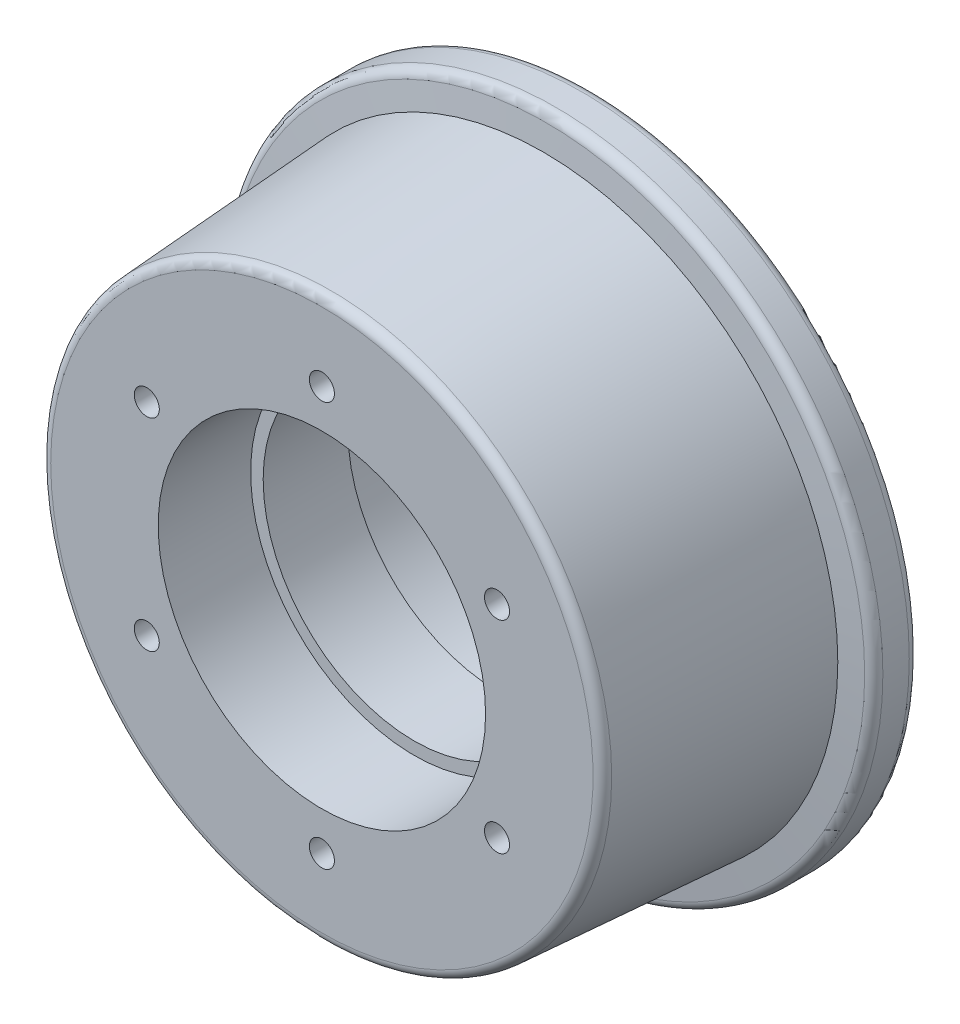
ISO-10303-21;
HEADER;
FILE_DESCRIPTION(('STEP AP214'),'2;1');
FILE_NAME('part.step','',(''),(''),'','','');
FILE_SCHEMA(('AUTOMOTIVE_DESIGN { 1 0 10303 214 1 1 1 1 }'));
ENDSEC;
DATA;
#1=APPLICATION_CONTEXT('core data for automotive mechanical design processes');
#2=APPLICATION_PROTOCOL_DEFINITION('international standard','automotive_design',2000,#1);
#3=PRODUCT_CONTEXT('',#1,'mechanical');
#4=PRODUCT('Part','Part','',(#3));
#5=PRODUCT_RELATED_PRODUCT_CATEGORY('part','',(#4));
#6=PRODUCT_DEFINITION_FORMATION('','',#4);
#7=PRODUCT_DEFINITION_CONTEXT('part definition',#1,'design');
#8=PRODUCT_DEFINITION('design','',#6,#7);
#9=PRODUCT_DEFINITION_SHAPE('','',#8);
#10=(LENGTH_UNIT() NAMED_UNIT(*) SI_UNIT(.MILLI.,.METRE.));
#11=(NAMED_UNIT(*) PLANE_ANGLE_UNIT() SI_UNIT($,.RADIAN.));
#12=(NAMED_UNIT(*) SI_UNIT($,.STERADIAN.) SOLID_ANGLE_UNIT());
#13=UNCERTAINTY_MEASURE_WITH_UNIT(LENGTH_MEASURE(1.E-05),#10,'distance_accuracy_value','');
#14=(GEOMETRIC_REPRESENTATION_CONTEXT(3) GLOBAL_UNCERTAINTY_ASSIGNED_CONTEXT((#13)) GLOBAL_UNIT_ASSIGNED_CONTEXT((#10,
#11,#12)) REPRESENTATION_CONTEXT('',''));
#15=CARTESIAN_POINT('',(0.,0.,0.));
#16=DIRECTION('',(0.,0.,1.));
#17=DIRECTION('',(1.,0.,0.));
#18=AXIS2_PLACEMENT_3D('',#15,#16,#17);
#19=CARTESIAN_POINT('',(0.,78.5,22.));
#20=DIRECTION('',(0.,0.,-1.));
#21=DIRECTION('',(-1.,0.,0.));
#22=AXIS2_PLACEMENT_3D('',#19,#20,#21);
#23=PLANE('',#22);
#24=CARTESIAN_POINT('',(0.,0.,22.));
#25=DIRECTION('',(0.,0.,1.));
#26=DIRECTION('',(1.,0.,0.));
#27=AXIS2_PLACEMENT_3D('',#24,#25,#26);
#28=CIRCLE('',#27,78.5);
#29=CARTESIAN_POINT('',(78.5,0.,22.));
#30=VERTEX_POINT('',#29);
#31=EDGE_CURVE('E58',#30,#30,#28,.T.);
#32=ORIENTED_EDGE('',*,*,#31,.F.);
#33=EDGE_LOOP('',(#32));
#34=FACE_BOUND('',#33,.T.);
#35=CARTESIAN_POINT('',(0.,0.,22.));
#36=DIRECTION('',(0.,0.,1.));
#37=DIRECTION('',(1.,0.,0.));
#38=AXIS2_PLACEMENT_3D('',#35,#36,#37);
#39=CIRCLE('',#38,85.);
#40=CARTESIAN_POINT('',(85.,0.,22.));
#41=VERTEX_POINT('',#40);
#42=EDGE_CURVE('E82',#41,#41,#39,.T.);
#43=ORIENTED_EDGE('',*,*,#42,.T.);
#44=EDGE_LOOP('',(#43));
#45=FACE_BOUND('',#44,.T.);
#46=ADVANCED_FACE('F32',(#34,#45),#23,.F.);
#47=CARTESIAN_POINT('',(0.,0.,1000.));
#48=DIRECTION('',(0.,0.,1.));
#49=DIRECTION('',(1.,0.,0.));
#50=AXIS2_PLACEMENT_3D('',#47,#48,#49);
#51=CYLINDRICAL_SURFACE('',#50,78.5);
#52=CARTESIAN_POINT('',(0.,0.,-22.));
#53=DIRECTION('',(0.,0.,1.));
#54=DIRECTION('',(1.,0.,0.));
#55=AXIS2_PLACEMENT_3D('',#52,#53,#54);
#56=CIRCLE('',#55,78.5);
#57=CARTESIAN_POINT('',(78.5,0.,-22.));
#58=VERTEX_POINT('',#57);
#59=EDGE_CURVE('E61',#58,#58,#56,.T.);
#60=ORIENTED_EDGE('',*,*,#59,.F.);
#61=EDGE_LOOP('',(#60));
#62=FACE_BOUND('',#61,.T.);
#63=ORIENTED_EDGE('',*,*,#31,.T.);
#64=EDGE_LOOP('',(#63));
#65=FACE_BOUND('',#64,.T.);
#66=ADVANCED_FACE('F195',(#62,#65),#51,.F.);
#67=CARTESIAN_POINT('',(0.,78.5,-22.));
#68=DIRECTION('',(0.,0.,1.));
#69=DIRECTION('',(1.,0.,0.));
#70=AXIS2_PLACEMENT_3D('',#67,#68,#69);
#71=PLANE('',#70);
#72=CARTESIAN_POINT('',(0.,0.,-22.));
#73=DIRECTION('',(0.,0.,1.));
#74=DIRECTION('',(1.,0.,0.));
#75=AXIS2_PLACEMENT_3D('',#72,#73,#74);
#76=CIRCLE('',#75,85.);
#77=CARTESIAN_POINT('',(85.,0.,-22.));
#78=VERTEX_POINT('',#77);
#79=EDGE_CURVE('E64',#78,#78,#76,.T.);
#80=ORIENTED_EDGE('',*,*,#79,.F.);
#81=EDGE_LOOP('',(#80));
#82=FACE_BOUND('',#81,.T.);
#83=ORIENTED_EDGE('',*,*,#59,.T.);
#84=EDGE_LOOP('',(#83));
#85=FACE_BOUND('',#84,.T.);
#86=ADVANCED_FACE('F189',(#82,#85),#71,.F.);
#87=CARTESIAN_POINT('',(0.,0.,1000.));
#88=DIRECTION('',(0.,0.,1.));
#89=DIRECTION('',(1.,0.,0.));
#90=AXIS2_PLACEMENT_3D('',#87,#88,#89);
#91=CYLINDRICAL_SURFACE('',#90,85.);
#92=CARTESIAN_POINT('',(0.,0.,-75.));
#93=DIRECTION('',(0.,0.,1.));
#94=DIRECTION('',(1.,0.,0.));
#95=AXIS2_PLACEMENT_3D('',#92,#93,#94);
#96=CIRCLE('',#95,85.);
#97=CARTESIAN_POINT('',(85.,0.,-75.));
#98=VERTEX_POINT('',#97);
#99=EDGE_CURVE('E67',#98,#98,#96,.T.);
#100=ORIENTED_EDGE('',*,*,#99,.F.);
#101=EDGE_LOOP('',(#100));
#102=FACE_BOUND('',#101,.T.);
#103=ORIENTED_EDGE('',*,*,#79,.T.);
#104=EDGE_LOOP('',(#103));
#105=FACE_BOUND('',#104,.T.);
#106=ADVANCED_FACE('F171',(#102,#105),#91,.F.);
#107=CARTESIAN_POINT('',(0.,85.,-75.));
#108=DIRECTION('',(0.,0.,1.));
#109=DIRECTION('',(1.,0.,0.));
#110=AXIS2_PLACEMENT_3D('',#107,#108,#109);
#111=PLANE('',#110);
#112=CARTESIAN_POINT('',(99.5929214352098,57.5000000000012,-75.));
#113=DIRECTION('',(0.,0.,-1.));
#114=DIRECTION('',(-0.50000000000001,0.866025403784433,0.));
#115=AXIS2_PLACEMENT_3D('',#112,#113,#114);
#116=CIRCLE('',#115,8.);
#117=CARTESIAN_POINT('',(95.5929214352097,64.4282032302766,-75.));
#118=VERTEX_POINT('',#117);
#119=EDGE_CURVE('E152',#118,#118,#116,.T.);
#120=ORIENTED_EDGE('',*,*,#119,.F.);
#121=EDGE_LOOP('',(#120));
#122=FACE_BOUND('',#121,.T.);
#123=CARTESIAN_POINT('',(99.592921435211,-57.4999999999991,-75.));
#124=DIRECTION('',(0.,0.,-1.));
#125=DIRECTION('',(0.499999999999992,0.866025403784443,0.));
#126=AXIS2_PLACEMENT_3D('',#123,#124,#125);
#127=CIRCLE('',#126,8.);
#128=CARTESIAN_POINT('',(103.592921435211,-50.5717967697235,-75.));
#129=VERTEX_POINT('',#128);
#130=EDGE_CURVE('E146',#129,#129,#127,.T.);
#131=ORIENTED_EDGE('',*,*,#130,.F.);
#132=EDGE_LOOP('',(#131));
#133=FACE_BOUND('',#132,.T.);
#134=CARTESIAN_POINT('',(0.,-115.,-75.));
#135=DIRECTION('',(0.,0.,-1.));
#136=DIRECTION('',(1.,0.,0.));
#137=AXIS2_PLACEMENT_3D('',#134,#135,#136);
#138=CIRCLE('',#137,8.);
#139=CARTESIAN_POINT('',(8.,-115.,-75.));
#140=VERTEX_POINT('',#139);
#141=EDGE_CURVE('E140',#140,#140,#138,.T.);
#142=ORIENTED_EDGE('',*,*,#141,.F.);
#143=EDGE_LOOP('',(#142));
#144=FACE_BOUND('',#143,.T.);
#145=CARTESIAN_POINT('',(-99.5929214352102,-57.5000000000005,-75.));
#146=DIRECTION('',(0.,0.,-1.));
#147=DIRECTION('',(0.500000000000004,-0.866025403784436,0.));
#148=AXIS2_PLACEMENT_3D('',#145,#146,#147);
#149=CIRCLE('',#148,8.);
#150=CARTESIAN_POINT('',(-95.5929214352102,-64.428203230276,-75.));
#151=VERTEX_POINT('',#150);
#152=EDGE_CURVE('E134',#151,#151,#149,.T.);
#153=ORIENTED_EDGE('',*,*,#152,.F.);
#154=EDGE_LOOP('',(#153));
#155=FACE_BOUND('',#154,.T.);
#156=CARTESIAN_POINT('',(-99.5929214352106,57.4999999999998,-75.));
#157=DIRECTION('',(0.,0.,-1.));
#158=DIRECTION('',(-0.499999999999998,-0.86602540378444,0.));
#159=AXIS2_PLACEMENT_3D('',#156,#157,#158);
#160=CIRCLE('',#159,8.);
#161=CARTESIAN_POINT('',(-103.592921435211,50.5717967697243,-75.));
#162=VERTEX_POINT('',#161);
#163=EDGE_CURVE('E128',#162,#162,#160,.T.);
#164=ORIENTED_EDGE('',*,*,#163,.F.);
#165=EDGE_LOOP('',(#164));
#166=FACE_BOUND('',#165,.T.);
#167=CARTESIAN_POINT('',(0.,115.,-75.));
#168=DIRECTION('',(0.,0.,-1.));
#169=DIRECTION('',(-1.,0.,0.));
#170=AXIS2_PLACEMENT_3D('',#167,#168,#169);
#171=CIRCLE('',#170,8.);
#172=CARTESIAN_POINT('',(-8.,115.,-75.));
#173=VERTEX_POINT('',#172);
#174=EDGE_CURVE('E122',#173,#173,#171,.T.);
#175=ORIENTED_EDGE('',*,*,#174,.F.);
#176=EDGE_LOOP('',(#175));
#177=FACE_BOUND('',#176,.T.);
#178=CARTESIAN_POINT('',(0.,0.,-75.));
#179=DIRECTION('',(0.,0.,1.));
#180=DIRECTION('',(1.,0.,0.));
#181=AXIS2_PLACEMENT_3D('',#178,#179,#180);
#182=CIRCLE('',#181,140.);
#183=CARTESIAN_POINT('',(140.,0.,-75.));
#184=VERTEX_POINT('',#183);
#185=EDGE_CURVE('E70',#184,#184,#182,.T.);
#186=ORIENTED_EDGE('',*,*,#185,.F.);
#187=EDGE_LOOP('',(#186));
#188=FACE_BOUND('',#187,.T.);
#189=ORIENTED_EDGE('',*,*,#99,.T.);
#190=EDGE_LOOP('',(#189));
#191=FACE_BOUND('',#190,.T.);
#192=ADVANCED_FACE('F167',(#122,#133,#144,#155,#166,#177,#188,#191),#111,.F.);
#193=CARTESIAN_POINT('',(0.,0.,1000.));
#194=DIRECTION('',(0.,0.,1.));
#195=DIRECTION('',(1.,0.,0.));
#196=AXIS2_PLACEMENT_3D('',#193,#194,#195);
#197=CYLINDRICAL_SURFACE('',#196,140.);
#198=CARTESIAN_POINT('',(0.,0.,-69.9999999999998));
#199=DIRECTION('',(0.,0.,1.));
#200=DIRECTION('',(1.,0.,0.));
#201=AXIS2_PLACEMENT_3D('',#198,#199,#200);
#202=CIRCLE('',#201,140.);
#203=CARTESIAN_POINT('',(140.,0.,-69.9999999999998));
#204=VERTEX_POINT('',#203);
#205=EDGE_CURVE('E73',#204,#204,#202,.T.);
#206=ORIENTED_EDGE('',*,*,#205,.F.);
#207=EDGE_LOOP('',(#206));
#208=FACE_BOUND('',#207,.T.);
#209=ORIENTED_EDGE('',*,*,#185,.T.);
#210=EDGE_LOOP('',(#209));
#211=FACE_BOUND('',#210,.T.);
#212=ADVANCED_FACE('F170',(#208,#211),#197,.T.);
#213=CARTESIAN_POINT('',(0.,140.,-69.9999999999999));
#214=DIRECTION('',(0.,0.,1.));
#215=DIRECTION('',(1.,0.,0.));
#216=AXIS2_PLACEMENT_3D('',#213,#214,#215);
#217=PLANE('',#216);
#218=CARTESIAN_POINT('',(0.,0.,-69.9999999999999));
#219=DIRECTION('',(0.,0.,1.));
#220=DIRECTION('',(1.,0.,0.));
#221=AXIS2_PLACEMENT_3D('',#218,#219,#220);
#222=CIRCLE('',#221,165.);
#223=CARTESIAN_POINT('',(165.,0.,-69.9999999999999));
#224=VERTEX_POINT('',#223);
#225=EDGE_CURVE('E10',#224,#224,#222,.F.);
#226=ORIENTED_EDGE('',*,*,#225,.T.);
#227=EDGE_LOOP('',(#226));
#228=FACE_BOUND('',#227,.T.);
#229=ORIENTED_EDGE('',*,*,#205,.T.);
#230=EDGE_LOOP('',(#229));
#231=FACE_BOUND('',#230,.T.);
#232=ADVANCED_FACE('F237',(#228,#231),#217,.F.);
#233=CARTESIAN_POINT('',(0.,0.,1000.));
#234=DIRECTION('',(0.,0.,1.));
#235=DIRECTION('',(1.,0.,0.));
#236=AXIS2_PLACEMENT_3D('',#233,#234,#235);
#237=CYLINDRICAL_SURFACE('',#236,170.);
#238=CARTESIAN_POINT('',(0.,0.,-51.3000533890697));
#239=DIRECTION('',(0.,0.,-1.));
#240=DIRECTION('',(-1.,0.,0.));
#241=AXIS2_PLACEMENT_3D('',#238,#239,#240);
#242=CIRCLE('',#241,170.);
#243=CARTESIAN_POINT('',(-170.,0.,-51.3000533890697));
#244=VERTEX_POINT('',#243);
#245=EDGE_CURVE('E39',#244,#244,#242,.T.);
#246=ORIENTED_EDGE('',*,*,#245,.T.);
#247=EDGE_LOOP('',(#246));
#248=FACE_BOUND('',#247,.T.);
#249=CARTESIAN_POINT('',(0.,0.,-64.9999999999999));
#250=DIRECTION('',(0.,0.,1.));
#251=DIRECTION('',(1.,0.,0.));
#252=AXIS2_PLACEMENT_3D('',#249,#250,#251);
#253=CIRCLE('',#252,170.);
#254=CARTESIAN_POINT('',(170.,0.,-64.9999999999999));
#255=VERTEX_POINT('',#254);
#256=EDGE_CURVE('E43',#255,#255,#253,.T.);
#257=ORIENTED_EDGE('',*,*,#256,.T.);
#258=EDGE_LOOP('',(#257));
#259=FACE_BOUND('',#258,.T.);
#260=ADVANCED_FACE('F233',(#248,#259),#237,.T.);
#261=CARTESIAN_POINT('',(0.,0.,-46.7980331675806));
#262=DIRECTION('',(0.,0.,-1.));
#263=DIRECTION('',(-1.,0.,0.));
#264=AXIS2_PLACEMENT_3D('',#261,#262,#263);
#265=CONICAL_SURFACE('',#264,170.,1.46607657167524);
#266=CARTESIAN_POINT('',(0.,0.,-46.3274439122284));
#267=DIRECTION('',(0.,0.,1.));
#268=DIRECTION('',(1.,0.,0.));
#269=AXIS2_PLACEMENT_3D('',#266,#267,#268);
#270=CIRCLE('',#269,165.522642316338);
#271=CARTESIAN_POINT('',(165.522642316338,0.,-46.3274439122284));
#272=VERTEX_POINT('',#271);
#273=EDGE_CURVE('E47',#272,#272,#270,.T.);
#274=ORIENTED_EDGE('',*,*,#273,.T.);
#275=EDGE_LOOP('',(#274));
#276=FACE_BOUND('',#275,.T.);
#277=CARTESIAN_POINT('',(0.,0.,-44.9999999999999));
#278=DIRECTION('',(0.,0.,1.));
#279=DIRECTION('',(1.,0.,0.));
#280=AXIS2_PLACEMENT_3D('',#277,#278,#279);
#281=CIRCLE('',#280,152.892857142857);
#282=CARTESIAN_POINT('',(152.892857142857,0.,-44.9999999999999));
#283=VERTEX_POINT('',#282);
#284=EDGE_CURVE('E76',#283,#283,#281,.T.);
#285=ORIENTED_EDGE('',*,*,#284,.F.);
#286=EDGE_LOOP('',(#285));
#287=FACE_BOUND('',#286,.T.);
#288=ADVANCED_FACE('F224',(#276,#287),#265,.T.);
#289=CARTESIAN_POINT('',(0.,0.,-44.9999999999999));
#290=DIRECTION('',(0.,0.,-1.));
#291=DIRECTION('',(-1.,0.,0.));
#292=AXIS2_PLACEMENT_3D('',#289,#290,#291);
#293=CONICAL_SURFACE('',#292,152.892857142857,0.064197376373133);
#294=CARTESIAN_POINT('',(0.,0.,65.3207664465874));
#295=DIRECTION('',(0.,0.,1.));
#296=DIRECTION('',(1.,0.,0.));
#297=AXIS2_PLACEMENT_3D('',#294,#295,#296);
#298=CIRCLE('',#297,145.800807871291);
#299=CARTESIAN_POINT('',(145.800807871291,0.,65.3207664465874));
#300=VERTEX_POINT('',#299);
#301=EDGE_CURVE('E52',#300,#300,#298,.F.);
#302=ORIENTED_EDGE('',*,*,#301,.T.);
#303=EDGE_LOOP('',(#302));
#304=FACE_BOUND('',#303,.T.);
#305=ORIENTED_EDGE('',*,*,#284,.T.);
#306=EDGE_LOOP('',(#305));
#307=FACE_BOUND('',#306,.T.);
#308=ADVANCED_FACE('F218',(#304,#307),#293,.T.);
#309=CARTESIAN_POINT('',(0.,85.,70.));
#310=DIRECTION('',(0.,0.,-1.));
#311=DIRECTION('',(-1.,0.,0.));
#312=AXIS2_PLACEMENT_3D('',#309,#310,#311);
#313=PLANE('',#312);
#314=CARTESIAN_POINT('',(90.9326673973654,52.5000000000011,70.));
#315=DIRECTION('',(0.,0.,1.));
#316=DIRECTION('',(0.50000000000001,-0.866025403784433,0.));
#317=AXIS2_PLACEMENT_3D('',#314,#315,#316);
#318=CIRCLE('',#317,6.5);
#319=CARTESIAN_POINT('',(94.1826673973655,46.8708348754022,70.));
#320=VERTEX_POINT('',#319);
#321=EDGE_CURVE('E116',#320,#320,#318,.T.);
#322=ORIENTED_EDGE('',*,*,#321,.F.);
#323=EDGE_LOOP('',(#322));
#324=FACE_BOUND('',#323,.T.);
#325=CARTESIAN_POINT('',(90.9326673973665,-52.4999999999992,70.));
#326=DIRECTION('',(0.,0.,1.));
#327=DIRECTION('',(-0.499999999999992,-0.866025403784443,0.));
#328=AXIS2_PLACEMENT_3D('',#325,#326,#327);
#329=CIRCLE('',#328,6.5);
#330=CARTESIAN_POINT('',(87.6826673973666,-58.129165124598,70.));
#331=VERTEX_POINT('',#330);
#332=EDGE_CURVE('E110',#331,#331,#329,.T.);
#333=ORIENTED_EDGE('',*,*,#332,.F.);
#334=EDGE_LOOP('',(#333));
#335=FACE_BOUND('',#334,.T.);
#336=CARTESIAN_POINT('',(0.,-105.,70.));
#337=DIRECTION('',(0.,0.,1.));
#338=DIRECTION('',(-1.,0.,0.));
#339=AXIS2_PLACEMENT_3D('',#336,#337,#338);
#340=CIRCLE('',#339,6.5);
#341=CARTESIAN_POINT('',(-6.5,-105.,70.));
#342=VERTEX_POINT('',#341);
#343=EDGE_CURVE('E104',#342,#342,#340,.T.);
#344=ORIENTED_EDGE('',*,*,#343,.F.);
#345=EDGE_LOOP('',(#344));
#346=FACE_BOUND('',#345,.T.);
#347=CARTESIAN_POINT('',(-90.9326673973658,-52.5000000000004,70.));
#348=DIRECTION('',(0.,0.,1.));
#349=DIRECTION('',(-0.500000000000004,0.866025403784436,0.));
#350=AXIS2_PLACEMENT_3D('',#347,#348,#349);
#351=CIRCLE('',#350,6.5);
#352=CARTESIAN_POINT('',(-94.1826673973659,-46.8708348754016,70.));
#353=VERTEX_POINT('',#352);
#354=EDGE_CURVE('E98',#353,#353,#351,.T.);
#355=ORIENTED_EDGE('',*,*,#354,.F.);
#356=EDGE_LOOP('',(#355));
#357=FACE_BOUND('',#356,.T.);
#358=CARTESIAN_POINT('',(-90.9326673973662,52.4999999999998,70.));
#359=DIRECTION('',(0.,0.,1.));
#360=DIRECTION('',(0.499999999999998,0.86602540378444,0.));
#361=AXIS2_PLACEMENT_3D('',#358,#359,#360);
#362=CIRCLE('',#361,6.5);
#363=CARTESIAN_POINT('',(-87.6826673973662,58.1291651245987,70.));
#364=VERTEX_POINT('',#363);
#365=EDGE_CURVE('E92',#364,#364,#362,.T.);
#366=ORIENTED_EDGE('',*,*,#365,.F.);
#367=EDGE_LOOP('',(#366));
#368=FACE_BOUND('',#367,.T.);
#369=CARTESIAN_POINT('',(0.,105.,70.));
#370=DIRECTION('',(0.,0.,1.));
#371=DIRECTION('',(1.,0.,0.));
#372=AXIS2_PLACEMENT_3D('',#369,#370,#371);
#373=CIRCLE('',#372,6.5);
#374=CARTESIAN_POINT('',(6.5,105.,70.));
#375=VERTEX_POINT('',#374);
#376=EDGE_CURVE('E86',#375,#375,#373,.T.);
#377=ORIENTED_EDGE('',*,*,#376,.F.);
#378=EDGE_LOOP('',(#377));
#379=FACE_BOUND('',#378,.T.);
#380=CARTESIAN_POINT('',(0.,0.,70.));
#381=DIRECTION('',(0.,0.,-1.));
#382=DIRECTION('',(-1.,0.,0.));
#383=AXIS2_PLACEMENT_3D('',#380,#381,#382);
#384=CIRCLE('',#383,140.811107591039);
#385=CARTESIAN_POINT('',(-140.811107591039,0.,70.));
#386=VERTEX_POINT('',#385);
#387=EDGE_CURVE('E55',#386,#386,#384,.F.);
#388=ORIENTED_EDGE('',*,*,#387,.T.);
#389=EDGE_LOOP('',(#388));
#390=FACE_BOUND('',#389,.T.);
#391=CARTESIAN_POINT('',(0.,0.,70.0000000000001));
#392=DIRECTION('',(0.,0.,1.));
#393=DIRECTION('',(1.,0.,0.));
#394=AXIS2_PLACEMENT_3D('',#391,#392,#393);
#395=CIRCLE('',#394,85.);
#396=CARTESIAN_POINT('',(85.,0.,70.0000000000001));
#397=VERTEX_POINT('',#396);
#398=EDGE_CURVE('E79',#397,#397,#395,.T.);
#399=ORIENTED_EDGE('',*,*,#398,.F.);
#400=EDGE_LOOP('',(#399));
#401=FACE_BOUND('',#400,.T.);
#402=ADVANCED_FACE('F213',(#324,#335,#346,#357,#368,#379,#390,#401),#313,.F.);
#403=CARTESIAN_POINT('',(0.,0.,1000.));
#404=DIRECTION('',(0.,0.,1.));
#405=DIRECTION('',(1.,0.,0.));
#406=AXIS2_PLACEMENT_3D('',#403,#404,#405);
#407=CYLINDRICAL_SURFACE('',#406,85.);
#408=ORIENTED_EDGE('',*,*,#42,.F.);
#409=EDGE_LOOP('',(#408));
#410=FACE_BOUND('',#409,.T.);
#411=ORIENTED_EDGE('',*,*,#398,.T.);
#412=EDGE_LOOP('',(#411));
#413=FACE_BOUND('',#412,.T.);
#414=ADVANCED_FACE('F209',(#410,#413),#407,.F.);
#415=CARTESIAN_POINT('',(0.,0.,65.));
#416=DIRECTION('',(0.,0.,-1.));
#417=DIRECTION('',(-1.,0.,0.));
#418=AXIS2_PLACEMENT_3D('',#415,#416,#417);
#419=TOROIDAL_SURFACE('',#418,140.811107591039,5.);
#420=ORIENTED_EDGE('',*,*,#301,.F.);
#421=EDGE_LOOP('',(#420));
#422=FACE_BOUND('',#421,.T.);
#423=ORIENTED_EDGE('',*,*,#387,.F.);
#424=EDGE_LOOP('',(#423));
#425=FACE_BOUND('',#424,.T.);
#426=ADVANCED_FACE('F212',(#422,#425),#419,.T.);
#427=CARTESIAN_POINT('',(0.,0.,-51.3000533890697));
#428=DIRECTION('',(0.,0.,-1.));
#429=DIRECTION('',(-1.,0.,0.));
#430=AXIS2_PLACEMENT_3D('',#427,#428,#429);
#431=TOROIDAL_SURFACE('',#430,165.,5.);
#432=ORIENTED_EDGE('',*,*,#245,.F.);
#433=EDGE_LOOP('',(#432));
#434=FACE_BOUND('',#433,.T.);
#435=ORIENTED_EDGE('',*,*,#273,.F.);
#436=EDGE_LOOP('',(#435));
#437=FACE_BOUND('',#436,.T.);
#438=ADVANCED_FACE('F244',(#434,#437),#431,.T.);
#439=CARTESIAN_POINT('',(0.,0.,-64.9999999999999));
#440=DIRECTION('',(0.,0.,1.));
#441=DIRECTION('',(1.,0.,0.));
#442=AXIS2_PLACEMENT_3D('',#439,#440,#441);
#443=TOROIDAL_SURFACE('',#442,165.,5.);
#444=ORIENTED_EDGE('',*,*,#225,.F.);
#445=EDGE_LOOP('',(#444));
#446=FACE_BOUND('',#445,.T.);
#447=ORIENTED_EDGE('',*,*,#256,.F.);
#448=EDGE_LOOP('',(#447));
#449=FACE_BOUND('',#448,.T.);
#450=ADVANCED_FACE('F34',(#446,#449),#443,.T.);
#451=CARTESIAN_POINT('',(0.,105.,45.));
#452=DIRECTION('',(0.,0.,1.));
#453=DIRECTION('',(1.,0.,0.));
#454=AXIS2_PLACEMENT_3D('',#451,#452,#453);
#455=CYLINDRICAL_SURFACE('',#454,6.5);
#456=CARTESIAN_POINT('',(0.,105.,45.));
#457=DIRECTION('',(0.,0.,1.));
#458=DIRECTION('',(1.,0.,0.));
#459=AXIS2_PLACEMENT_3D('',#456,#457,#458);
#460=CIRCLE('',#459,6.5);
#461=CARTESIAN_POINT('',(6.5,105.,45.));
#462=VERTEX_POINT('',#461);
#463=EDGE_CURVE('E85',#462,#462,#460,.T.);
#464=ORIENTED_EDGE('',*,*,#463,.F.);
#465=EDGE_LOOP('',(#464));
#466=FACE_BOUND('',#465,.T.);
#467=ORIENTED_EDGE('',*,*,#376,.T.);
#468=EDGE_LOOP('',(#467));
#469=FACE_BOUND('',#468,.T.);
#470=ADVANCED_FACE('F251',(#466,#469),#455,.F.);
#471=CARTESIAN_POINT('',(0.,105.,45.));
#472=DIRECTION('',(0.,0.,1.));
#473=DIRECTION('',(1.,0.,0.));
#474=AXIS2_PLACEMENT_3D('',#471,#472,#473);
#475=PLANE('',#474);
#476=ORIENTED_EDGE('',*,*,#463,.T.);
#477=EDGE_LOOP('',(#476));
#478=FACE_BOUND('',#477,.T.);
#479=ADVANCED_FACE('F261',(#478),#475,.T.);
#480=CARTESIAN_POINT('',(-90.9326673973662,52.4999999999998,45.));
#481=DIRECTION('',(0.,0.,1.));
#482=DIRECTION('',(1.,0.,0.));
#483=AXIS2_PLACEMENT_3D('',#480,#481,#482);
#484=CYLINDRICAL_SURFACE('',#483,6.5);
#485=CARTESIAN_POINT('',(-90.9326673973662,52.4999999999998,45.));
#486=DIRECTION('',(0.,0.,1.));
#487=DIRECTION('',(0.499999999999998,0.86602540378444,0.));
#488=AXIS2_PLACEMENT_3D('',#485,#486,#487);
#489=CIRCLE('',#488,6.5);
#490=CARTESIAN_POINT('',(-87.6826673973662,58.1291651245987,45.));
#491=VERTEX_POINT('',#490);
#492=EDGE_CURVE('E89',#491,#491,#489,.T.);
#493=ORIENTED_EDGE('',*,*,#492,.F.);
#494=EDGE_LOOP('',(#493));
#495=FACE_BOUND('',#494,.T.);
#496=ORIENTED_EDGE('',*,*,#365,.T.);
#497=EDGE_LOOP('',(#496));
#498=FACE_BOUND('',#497,.T.);
#499=ADVANCED_FACE('F269',(#495,#498),#484,.F.);
#500=CARTESIAN_POINT('',(-90.9326673973662,52.4999999999998,45.));
#501=DIRECTION('',(0.,0.,1.));
#502=DIRECTION('',(0.499999999999998,0.86602540378444,0.));
#503=AXIS2_PLACEMENT_3D('',#500,#501,#502);
#504=PLANE('',#503);
#505=ORIENTED_EDGE('',*,*,#492,.T.);
#506=EDGE_LOOP('',(#505));
#507=FACE_BOUND('',#506,.T.);
#508=ADVANCED_FACE('F277',(#507),#504,.T.);
#509=CARTESIAN_POINT('',(-90.9326673973658,-52.5000000000004,45.));
#510=DIRECTION('',(0.,0.,1.));
#511=DIRECTION('',(1.,0.,0.));
#512=AXIS2_PLACEMENT_3D('',#509,#510,#511);
#513=CYLINDRICAL_SURFACE('',#512,6.5);
#514=CARTESIAN_POINT('',(-90.9326673973658,-52.5000000000004,45.));
#515=DIRECTION('',(0.,0.,1.));
#516=DIRECTION('',(-0.500000000000004,0.866025403784436,0.));
#517=AXIS2_PLACEMENT_3D('',#514,#515,#516);
#518=CIRCLE('',#517,6.5);
#519=CARTESIAN_POINT('',(-94.1826673973659,-46.8708348754016,45.));
#520=VERTEX_POINT('',#519);
#521=EDGE_CURVE('E95',#520,#520,#518,.T.);
#522=ORIENTED_EDGE('',*,*,#521,.F.);
#523=EDGE_LOOP('',(#522));
#524=FACE_BOUND('',#523,.T.);
#525=ORIENTED_EDGE('',*,*,#354,.T.);
#526=EDGE_LOOP('',(#525));
#527=FACE_BOUND('',#526,.T.);
#528=ADVANCED_FACE('F281',(#524,#527),#513,.F.);
#529=CARTESIAN_POINT('',(-90.9326673973658,-52.5000000000004,45.));
#530=DIRECTION('',(0.,0.,1.));
#531=DIRECTION('',(-0.500000000000004,0.866025403784436,0.));
#532=AXIS2_PLACEMENT_3D('',#529,#530,#531);
#533=PLANE('',#532);
#534=ORIENTED_EDGE('',*,*,#521,.T.);
#535=EDGE_LOOP('',(#534));
#536=FACE_BOUND('',#535,.T.);
#537=ADVANCED_FACE('F285',(#536),#533,.T.);
#538=CARTESIAN_POINT('',(0.,-105.,45.));
#539=DIRECTION('',(0.,0.,1.));
#540=DIRECTION('',(1.,0.,0.));
#541=AXIS2_PLACEMENT_3D('',#538,#539,#540);
#542=CYLINDRICAL_SURFACE('',#541,6.5);
#543=CARTESIAN_POINT('',(0.,-105.,45.));
#544=DIRECTION('',(0.,0.,1.));
#545=DIRECTION('',(-1.,0.,0.));
#546=AXIS2_PLACEMENT_3D('',#543,#544,#545);
#547=CIRCLE('',#546,6.5);
#548=CARTESIAN_POINT('',(-6.5,-105.,45.));
#549=VERTEX_POINT('',#548);
#550=EDGE_CURVE('E101',#549,#549,#547,.T.);
#551=ORIENTED_EDGE('',*,*,#550,.F.);
#552=EDGE_LOOP('',(#551));
#553=FACE_BOUND('',#552,.T.);
#554=ORIENTED_EDGE('',*,*,#343,.T.);
#555=EDGE_LOOP('',(#554));
#556=FACE_BOUND('',#555,.T.);
#557=ADVANCED_FACE('F289',(#553,#556),#542,.F.);
#558=CARTESIAN_POINT('',(0.,-105.,45.));
#559=DIRECTION('',(0.,0.,1.));
#560=DIRECTION('',(-1.,0.,0.));
#561=AXIS2_PLACEMENT_3D('',#558,#559,#560);
#562=PLANE('',#561);
#563=ORIENTED_EDGE('',*,*,#550,.T.);
#564=EDGE_LOOP('',(#563));
#565=FACE_BOUND('',#564,.T.);
#566=ADVANCED_FACE('F293',(#565),#562,.T.);
#567=CARTESIAN_POINT('',(90.9326673973665,-52.4999999999992,45.));
#568=DIRECTION('',(0.,0.,1.));
#569=DIRECTION('',(1.,0.,0.));
#570=AXIS2_PLACEMENT_3D('',#567,#568,#569);
#571=CYLINDRICAL_SURFACE('',#570,6.5);
#572=CARTESIAN_POINT('',(90.9326673973665,-52.4999999999992,45.));
#573=DIRECTION('',(0.,0.,1.));
#574=DIRECTION('',(-0.499999999999992,-0.866025403784443,0.));
#575=AXIS2_PLACEMENT_3D('',#572,#573,#574);
#576=CIRCLE('',#575,6.5);
#577=CARTESIAN_POINT('',(87.6826673973666,-58.129165124598,45.));
#578=VERTEX_POINT('',#577);
#579=EDGE_CURVE('E107',#578,#578,#576,.T.);
#580=ORIENTED_EDGE('',*,*,#579,.F.);
#581=EDGE_LOOP('',(#580));
#582=FACE_BOUND('',#581,.T.);
#583=ORIENTED_EDGE('',*,*,#332,.T.);
#584=EDGE_LOOP('',(#583));
#585=FACE_BOUND('',#584,.T.);
#586=ADVANCED_FACE('F297',(#582,#585),#571,.F.);
#587=CARTESIAN_POINT('',(90.9326673973665,-52.4999999999992,45.));
#588=DIRECTION('',(0.,0.,1.));
#589=DIRECTION('',(-0.499999999999992,-0.866025403784443,0.));
#590=AXIS2_PLACEMENT_3D('',#587,#588,#589);
#591=PLANE('',#590);
#592=ORIENTED_EDGE('',*,*,#579,.T.);
#593=EDGE_LOOP('',(#592));
#594=FACE_BOUND('',#593,.T.);
#595=ADVANCED_FACE('F301',(#594),#591,.T.);
#596=CARTESIAN_POINT('',(90.9326673973654,52.5000000000011,45.));
#597=DIRECTION('',(0.,0.,1.));
#598=DIRECTION('',(1.,0.,0.));
#599=AXIS2_PLACEMENT_3D('',#596,#597,#598);
#600=CYLINDRICAL_SURFACE('',#599,6.5);
#601=CARTESIAN_POINT('',(90.9326673973654,52.5000000000011,45.));
#602=DIRECTION('',(0.,0.,1.));
#603=DIRECTION('',(0.50000000000001,-0.866025403784433,0.));
#604=AXIS2_PLACEMENT_3D('',#601,#602,#603);
#605=CIRCLE('',#604,6.5);
#606=CARTESIAN_POINT('',(94.1826673973655,46.8708348754022,45.));
#607=VERTEX_POINT('',#606);
#608=EDGE_CURVE('E113',#607,#607,#605,.T.);
#609=ORIENTED_EDGE('',*,*,#608,.F.);
#610=EDGE_LOOP('',(#609));
#611=FACE_BOUND('',#610,.T.);
#612=ORIENTED_EDGE('',*,*,#321,.T.);
#613=EDGE_LOOP('',(#612));
#614=FACE_BOUND('',#613,.T.);
#615=ADVANCED_FACE('F305',(#611,#614),#600,.F.);
#616=CARTESIAN_POINT('',(90.9326673973654,52.5000000000011,45.));
#617=DIRECTION('',(0.,0.,1.));
#618=DIRECTION('',(0.50000000000001,-0.866025403784433,0.));
#619=AXIS2_PLACEMENT_3D('',#616,#617,#618);
#620=PLANE('',#619);
#621=ORIENTED_EDGE('',*,*,#608,.T.);
#622=EDGE_LOOP('',(#621));
#623=FACE_BOUND('',#622,.T.);
#624=ADVANCED_FACE('F309',(#623),#620,.T.);
#625=CARTESIAN_POINT('',(0.,115.,-40.));
#626=DIRECTION('',(0.,0.,-1.));
#627=DIRECTION('',(-1.,0.,0.));
#628=AXIS2_PLACEMENT_3D('',#625,#626,#627);
#629=CYLINDRICAL_SURFACE('',#628,8.);
#630=CARTESIAN_POINT('',(0.,115.,-40.));
#631=DIRECTION('',(0.,0.,-1.));
#632=DIRECTION('',(-1.,0.,0.));
#633=AXIS2_PLACEMENT_3D('',#630,#631,#632);
#634=CIRCLE('',#633,8.);
#635=CARTESIAN_POINT('',(-8.,115.,-40.));
#636=VERTEX_POINT('',#635);
#637=EDGE_CURVE('E119',#636,#636,#634,.T.);
#638=ORIENTED_EDGE('',*,*,#637,.F.);
#639=EDGE_LOOP('',(#638));
#640=FACE_BOUND('',#639,.T.);
#641=ORIENTED_EDGE('',*,*,#174,.T.);
#642=EDGE_LOOP('',(#641));
#643=FACE_BOUND('',#642,.T.);
#644=ADVANCED_FACE('F313',(#640,#643),#629,.F.);
#645=CARTESIAN_POINT('',(0.,115.,-40.));
#646=DIRECTION('',(0.,0.,-1.));
#647=DIRECTION('',(-1.,0.,0.));
#648=AXIS2_PLACEMENT_3D('',#645,#646,#647);
#649=PLANE('',#648);
#650=ORIENTED_EDGE('',*,*,#637,.T.);
#651=EDGE_LOOP('',(#650));
#652=FACE_BOUND('',#651,.T.);
#653=ADVANCED_FACE('F317',(#652),#649,.T.);
#654=CARTESIAN_POINT('',(-99.5929214352106,57.4999999999998,-40.));
#655=DIRECTION('',(0.,0.,-1.));
#656=DIRECTION('',(-1.,0.,0.));
#657=AXIS2_PLACEMENT_3D('',#654,#655,#656);
#658=CYLINDRICAL_SURFACE('',#657,8.);
#659=CARTESIAN_POINT('',(-99.5929214352106,57.4999999999998,-40.));
#660=DIRECTION('',(0.,0.,-1.));
#661=DIRECTION('',(-0.499999999999998,-0.86602540378444,0.));
#662=AXIS2_PLACEMENT_3D('',#659,#660,#661);
#663=CIRCLE('',#662,8.);
#664=CARTESIAN_POINT('',(-103.592921435211,50.5717967697243,-40.));
#665=VERTEX_POINT('',#664);
#666=EDGE_CURVE('E125',#665,#665,#663,.T.);
#667=ORIENTED_EDGE('',*,*,#666,.F.);
#668=EDGE_LOOP('',(#667));
#669=FACE_BOUND('',#668,.T.);
#670=ORIENTED_EDGE('',*,*,#163,.T.);
#671=EDGE_LOOP('',(#670));
#672=FACE_BOUND('',#671,.T.);
#673=ADVANCED_FACE('F321',(#669,#672),#658,.F.);
#674=CARTESIAN_POINT('',(-99.5929214352106,57.4999999999998,-40.));
#675=DIRECTION('',(0.,0.,-1.));
#676=DIRECTION('',(-0.499999999999998,-0.86602540378444,0.));
#677=AXIS2_PLACEMENT_3D('',#674,#675,#676);
#678=PLANE('',#677);
#679=ORIENTED_EDGE('',*,*,#666,.T.);
#680=EDGE_LOOP('',(#679));
#681=FACE_BOUND('',#680,.T.);
#682=ADVANCED_FACE('F325',(#681),#678,.T.);
#683=CARTESIAN_POINT('',(-99.5929214352102,-57.5000000000005,-40.));
#684=DIRECTION('',(0.,0.,-1.));
#685=DIRECTION('',(-1.,0.,0.));
#686=AXIS2_PLACEMENT_3D('',#683,#684,#685);
#687=CYLINDRICAL_SURFACE('',#686,8.);
#688=CARTESIAN_POINT('',(-99.5929214352102,-57.5000000000005,-40.));
#689=DIRECTION('',(0.,0.,-1.));
#690=DIRECTION('',(0.500000000000004,-0.866025403784436,0.));
#691=AXIS2_PLACEMENT_3D('',#688,#689,#690);
#692=CIRCLE('',#691,8.);
#693=CARTESIAN_POINT('',(-95.5929214352102,-64.428203230276,-40.));
#694=VERTEX_POINT('',#693);
#695=EDGE_CURVE('E131',#694,#694,#692,.T.);
#696=ORIENTED_EDGE('',*,*,#695,.F.);
#697=EDGE_LOOP('',(#696));
#698=FACE_BOUND('',#697,.T.);
#699=ORIENTED_EDGE('',*,*,#152,.T.);
#700=EDGE_LOOP('',(#699));
#701=FACE_BOUND('',#700,.T.);
#702=ADVANCED_FACE('F329',(#698,#701),#687,.F.);
#703=CARTESIAN_POINT('',(-99.5929214352102,-57.5000000000005,-40.));
#704=DIRECTION('',(0.,0.,-1.));
#705=DIRECTION('',(0.500000000000004,-0.866025403784436,0.));
#706=AXIS2_PLACEMENT_3D('',#703,#704,#705);
#707=PLANE('',#706);
#708=ORIENTED_EDGE('',*,*,#695,.T.);
#709=EDGE_LOOP('',(#708));
#710=FACE_BOUND('',#709,.T.);
#711=ADVANCED_FACE('F333',(#710),#707,.T.);
#712=CARTESIAN_POINT('',(0.,-115.,-40.));
#713=DIRECTION('',(0.,0.,-1.));
#714=DIRECTION('',(-1.,0.,0.));
#715=AXIS2_PLACEMENT_3D('',#712,#713,#714);
#716=CYLINDRICAL_SURFACE('',#715,8.);
#717=CARTESIAN_POINT('',(0.,-115.,-40.));
#718=DIRECTION('',(0.,0.,-1.));
#719=DIRECTION('',(1.,0.,0.));
#720=AXIS2_PLACEMENT_3D('',#717,#718,#719);
#721=CIRCLE('',#720,8.);
#722=CARTESIAN_POINT('',(8.,-115.,-40.));
#723=VERTEX_POINT('',#722);
#724=EDGE_CURVE('E137',#723,#723,#721,.T.);
#725=ORIENTED_EDGE('',*,*,#724,.F.);
#726=EDGE_LOOP('',(#725));
#727=FACE_BOUND('',#726,.T.);
#728=ORIENTED_EDGE('',*,*,#141,.T.);
#729=EDGE_LOOP('',(#728));
#730=FACE_BOUND('',#729,.T.);
#731=ADVANCED_FACE('F337',(#727,#730),#716,.F.);
#732=CARTESIAN_POINT('',(0.,-115.,-40.));
#733=DIRECTION('',(0.,0.,-1.));
#734=DIRECTION('',(1.,0.,0.));
#735=AXIS2_PLACEMENT_3D('',#732,#733,#734);
#736=PLANE('',#735);
#737=ORIENTED_EDGE('',*,*,#724,.T.);
#738=EDGE_LOOP('',(#737));
#739=FACE_BOUND('',#738,.T.);
#740=ADVANCED_FACE('F341',(#739),#736,.T.);
#741=CARTESIAN_POINT('',(99.592921435211,-57.4999999999991,-40.));
#742=DIRECTION('',(0.,0.,-1.));
#743=DIRECTION('',(-1.,0.,0.));
#744=AXIS2_PLACEMENT_3D('',#741,#742,#743);
#745=CYLINDRICAL_SURFACE('',#744,8.);
#746=CARTESIAN_POINT('',(99.592921435211,-57.4999999999991,-40.));
#747=DIRECTION('',(0.,0.,-1.));
#748=DIRECTION('',(0.499999999999992,0.866025403784443,0.));
#749=AXIS2_PLACEMENT_3D('',#746,#747,#748);
#750=CIRCLE('',#749,8.);
#751=CARTESIAN_POINT('',(103.592921435211,-50.5717967697235,-40.));
#752=VERTEX_POINT('',#751);
#753=EDGE_CURVE('E143',#752,#752,#750,.T.);
#754=ORIENTED_EDGE('',*,*,#753,.F.);
#755=EDGE_LOOP('',(#754));
#756=FACE_BOUND('',#755,.T.);
#757=ORIENTED_EDGE('',*,*,#130,.T.);
#758=EDGE_LOOP('',(#757));
#759=FACE_BOUND('',#758,.T.);
#760=ADVANCED_FACE('F345',(#756,#759),#745,.F.);
#761=CARTESIAN_POINT('',(99.592921435211,-57.4999999999991,-40.));
#762=DIRECTION('',(0.,0.,-1.));
#763=DIRECTION('',(0.499999999999992,0.866025403784443,0.));
#764=AXIS2_PLACEMENT_3D('',#761,#762,#763);
#765=PLANE('',#764);
#766=ORIENTED_EDGE('',*,*,#753,.T.);
#767=EDGE_LOOP('',(#766));
#768=FACE_BOUND('',#767,.T.);
#769=ADVANCED_FACE('F163',(#768),#765,.T.);
#770=CARTESIAN_POINT('',(99.5929214352098,57.5000000000012,-40.));
#771=DIRECTION('',(0.,0.,-1.));
#772=DIRECTION('',(-1.,0.,0.));
#773=AXIS2_PLACEMENT_3D('',#770,#771,#772);
#774=CYLINDRICAL_SURFACE('',#773,8.);
#775=CARTESIAN_POINT('',(99.5929214352098,57.5000000000012,-40.));
#776=DIRECTION('',(0.,0.,-1.));
#777=DIRECTION('',(-0.50000000000001,0.866025403784433,0.));
#778=AXIS2_PLACEMENT_3D('',#775,#776,#777);
#779=CIRCLE('',#778,8.);
#780=CARTESIAN_POINT('',(95.5929214352097,64.4282032302766,-40.));
#781=VERTEX_POINT('',#780);
#782=EDGE_CURVE('E149',#781,#781,#779,.T.);
#783=ORIENTED_EDGE('',*,*,#782,.F.);
#784=EDGE_LOOP('',(#783));
#785=FACE_BOUND('',#784,.T.);
#786=ORIENTED_EDGE('',*,*,#119,.T.);
#787=EDGE_LOOP('',(#786));
#788=FACE_BOUND('',#787,.T.);
#789=ADVANCED_FACE('F160',(#785,#788),#774,.F.);
#790=CARTESIAN_POINT('',(99.5929214352098,57.5000000000012,-40.));
#791=DIRECTION('',(0.,0.,-1.));
#792=DIRECTION('',(-0.50000000000001,0.866025403784433,0.));
#793=AXIS2_PLACEMENT_3D('',#790,#791,#792);
#794=PLANE('',#793);
#795=ORIENTED_EDGE('',*,*,#782,.T.);
#796=EDGE_LOOP('',(#795));
#797=FACE_BOUND('',#796,.T.);
#798=ADVANCED_FACE('F158',(#797),#794,.T.);
#799=CLOSED_SHELL('',(#46,#66,#86,#106,#192,#212,#232,#260,#288,#308,#402,#414,#426,#438,#450,
#470,#479,#499,#508,#528,#537,#557,#566,#586,#595,#615,#624,#644,#653,#673,#682,#702,#711,#731,
#740,#760,#769,#789,#798));
#800=MANIFOLD_SOLID_BREP('B2',#799);
#801=ADVANCED_BREP_SHAPE_REPRESENTATION('',(#18,#800),#14);
#802=SHAPE_DEFINITION_REPRESENTATION(#9,#801);
ENDSEC;
END-ISO-10303-21;
